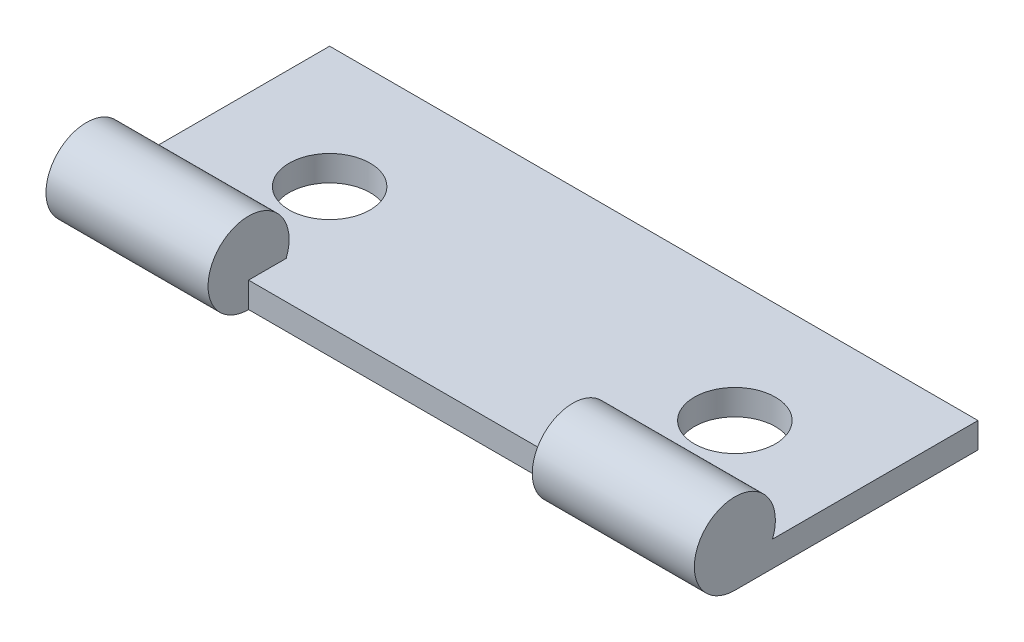
ISO-10303-21;
HEADER;
FILE_DESCRIPTION(('STEP AP214'),'2;1');
FILE_NAME('part.step','',(''),(''),'','','');
FILE_SCHEMA(('AUTOMOTIVE_DESIGN { 1 0 10303 214 1 1 1 1 }'));
ENDSEC;
DATA;
#1=APPLICATION_CONTEXT('core data for automotive mechanical design processes');
#2=APPLICATION_PROTOCOL_DEFINITION('international standard','automotive_design',2000,#1);
#3=PRODUCT_CONTEXT('',#1,'mechanical');
#4=PRODUCT('Part','Part','',(#3));
#5=PRODUCT_RELATED_PRODUCT_CATEGORY('part','',(#4));
#6=PRODUCT_DEFINITION_FORMATION('','',#4);
#7=PRODUCT_DEFINITION_CONTEXT('part definition',#1,'design');
#8=PRODUCT_DEFINITION('design','',#6,#7);
#9=PRODUCT_DEFINITION_SHAPE('','',#8);
#10=(LENGTH_UNIT() NAMED_UNIT(*) SI_UNIT(.MILLI.,.METRE.));
#11=(NAMED_UNIT(*) PLANE_ANGLE_UNIT() SI_UNIT($,.RADIAN.));
#12=(NAMED_UNIT(*) SI_UNIT($,.STERADIAN.) SOLID_ANGLE_UNIT());
#13=UNCERTAINTY_MEASURE_WITH_UNIT(LENGTH_MEASURE(1.E-05),#10,'distance_accuracy_value','');
#14=(GEOMETRIC_REPRESENTATION_CONTEXT(3) GLOBAL_UNCERTAINTY_ASSIGNED_CONTEXT((#13)) GLOBAL_UNIT_ASSIGNED_CONTEXT((#10,
#11,#12)) REPRESENTATION_CONTEXT('',''));
#15=CARTESIAN_POINT('',(0.,0.,0.));
#16=DIRECTION('',(0.,0.,1.));
#17=DIRECTION('',(1.,0.,0.));
#18=AXIS2_PLACEMENT_3D('',#15,#16,#17);
#19=CARTESIAN_POINT('',(0.,1.,0.));
#20=DIRECTION('',(0.,0.,-1.));
#21=DIRECTION('',(-1.,0.,0.));
#22=AXIS2_PLACEMENT_3D('',#19,#20,#21);
#23=PLANE('',#22);
#24=DIRECTION('',(1.,0.,0.));
#25=VECTOR('',#24,1.);
#26=CARTESIAN_POINT('',(0.,0.,0.));
#27=LINE('',#26,#25);
#28=CARTESIAN_POINT('',(6.35,0.,0.));
#29=VERTEX_POINT('',#28);
#30=CARTESIAN_POINT('',(19.05,0.,0.));
#31=VERTEX_POINT('',#30);
#32=EDGE_CURVE('E160',#29,#31,#27,.T.);
#33=ORIENTED_EDGE('',*,*,#32,.T.);
#34=DIRECTION('',(0.,1.,0.));
#35=VECTOR('',#34,1.);
#36=CARTESIAN_POINT('',(19.05,1.,0.));
#37=LINE('',#36,#35);
#38=CARTESIAN_POINT('',(19.05,1.,0.));
#39=VERTEX_POINT('',#38);
#40=EDGE_CURVE('E58',#31,#39,#37,.T.);
#41=ORIENTED_EDGE('',*,*,#40,.T.);
#42=DIRECTION('',(1.,0.,0.));
#43=VECTOR('',#42,1.);
#44=CARTESIAN_POINT('',(0.,1.,0.));
#45=LINE('',#44,#43);
#46=CARTESIAN_POINT('',(6.35,1.,0.));
#47=VERTEX_POINT('',#46);
#48=EDGE_CURVE('E153',#47,#39,#45,.T.);
#49=ORIENTED_EDGE('',*,*,#48,.F.);
#50=DIRECTION('',(0.,1.,0.));
#51=VECTOR('',#50,1.);
#52=CARTESIAN_POINT('',(6.35,1.,0.));
#53=LINE('',#52,#51);
#54=EDGE_CURVE('E11',#29,#47,#53,.T.);
#55=ORIENTED_EDGE('',*,*,#54,.F.);
#56=EDGE_LOOP('',(#33,#41,#49,#55));
#57=FACE_BOUND('',#56,.T.);
#58=ADVANCED_FACE('F35',(#57),#23,.F.);
#59=CARTESIAN_POINT('',(0.,1.,0.));
#60=DIRECTION('',(0.,-1.,0.));
#61=DIRECTION('',(0.,0.,-1.));
#62=AXIS2_PLACEMENT_3D('',#59,#60,#61);
#63=PLANE('',#62);
#64=DIRECTION('',(0.,0.,-1.));
#65=VECTOR('',#64,1.);
#66=CARTESIAN_POINT('',(19.05,1.,0.));
#67=LINE('',#66,#65);
#68=CARTESIAN_POINT('',(19.05,1.,-1.47478812037526));
#69=VERTEX_POINT('',#68);
#70=EDGE_CURVE('E50',#39,#69,#67,.T.);
#71=ORIENTED_EDGE('',*,*,#70,.T.);
#72=DIRECTION('',(-1.,0.,0.));
#73=VECTOR('',#72,1.);
#74=CARTESIAN_POINT('',(25.4,1.,-1.47478812037526));
#75=LINE('',#74,#73);
#76=CARTESIAN_POINT('',(25.4,1.,-1.47478812037526));
#77=VERTEX_POINT('',#76);
#78=EDGE_CURVE('E116',#69,#77,#75,.F.);
#79=ORIENTED_EDGE('',*,*,#78,.T.);
#80=DIRECTION('',(0.,0.,-1.));
#81=VECTOR('',#80,1.);
#82=CARTESIAN_POINT('',(25.4,1.,0.));
#83=LINE('',#82,#81);
#84=CARTESIAN_POINT('',(25.4,1.,-9.525));
#85=VERTEX_POINT('',#84);
#86=EDGE_CURVE('E120',#77,#85,#83,.T.);
#87=ORIENTED_EDGE('',*,*,#86,.T.);
#88=DIRECTION('',(-1.,0.,0.));
#89=VECTOR('',#88,1.);
#90=CARTESIAN_POINT('',(0.,1.,-9.525));
#91=LINE('',#90,#89);
#92=CARTESIAN_POINT('',(0.,1.,-9.525));
#93=VERTEX_POINT('',#92);
#94=EDGE_CURVE('E156',#85,#93,#91,.T.);
#95=ORIENTED_EDGE('',*,*,#94,.T.);
#96=DIRECTION('',(0.,0.,1.));
#97=VECTOR('',#96,1.);
#98=CARTESIAN_POINT('',(0.,1.,0.));
#99=LINE('',#98,#97);
#100=CARTESIAN_POINT('',(0.,1.,-1.47478812037526));
#101=VERTEX_POINT('',#100);
#102=EDGE_CURVE('E151',#93,#101,#99,.T.);
#103=ORIENTED_EDGE('',*,*,#102,.T.);
#104=DIRECTION('',(-1.,0.,0.));
#105=VECTOR('',#104,1.);
#106=CARTESIAN_POINT('',(6.35,1.,-1.47478812037526));
#107=LINE('',#106,#105);
#108=CARTESIAN_POINT('',(6.35,1.,-1.47478812037526));
#109=VERTEX_POINT('',#108);
#110=EDGE_CURVE('E136',#101,#109,#107,.F.);
#111=ORIENTED_EDGE('',*,*,#110,.T.);
#112=DIRECTION('',(0.,0.,-1.));
#113=VECTOR('',#112,1.);
#114=CARTESIAN_POINT('',(6.35,1.,0.));
#115=LINE('',#114,#113);
#116=EDGE_CURVE('E131',#47,#109,#115,.T.);
#117=ORIENTED_EDGE('',*,*,#116,.F.);
#118=ORIENTED_EDGE('',*,*,#48,.T.);
#119=EDGE_LOOP('',(#71,#79,#87,#95,#103,#111,#117,#118));
#120=FACE_BOUND('',#119,.T.);
#121=CARTESIAN_POINT('',(4.7625,1.,-4.7625));
#122=DIRECTION('',(0.,1.,0.));
#123=DIRECTION('',(0.,0.,1.));
#124=AXIS2_PLACEMENT_3D('',#121,#122,#123);
#125=CIRCLE('',#124,1.5875);
#126=CARTESIAN_POINT('',(4.7625,1.,-3.175));
#127=VERTEX_POINT('',#126);
#128=EDGE_CURVE('E145',#127,#127,#125,.T.);
#129=ORIENTED_EDGE('',*,*,#128,.F.);
#130=EDGE_LOOP('',(#129));
#131=FACE_BOUND('',#130,.T.);
#132=CARTESIAN_POINT('',(20.6375,1.,-4.7625));
#133=DIRECTION('',(0.,1.,0.));
#134=DIRECTION('',(0.,0.,-1.));
#135=AXIS2_PLACEMENT_3D('',#132,#133,#134);
#136=CIRCLE('',#135,1.5875);
#137=CARTESIAN_POINT('',(20.6375,1.,-6.35000000000001));
#138=VERTEX_POINT('',#137);
#139=EDGE_CURVE('E139',#138,#138,#136,.T.);
#140=ORIENTED_EDGE('',*,*,#139,.F.);
#141=EDGE_LOOP('',(#140));
#142=FACE_BOUND('',#141,.T.);
#143=ADVANCED_FACE('F170',(#120,#131,#142),#63,.F.);
#144=CARTESIAN_POINT('',(0.,0.,0.));
#145=DIRECTION('',(0.,-1.,0.));
#146=DIRECTION('',(0.,0.,-1.));
#147=AXIS2_PLACEMENT_3D('',#144,#145,#146);
#148=PLANE('',#147);
#149=CARTESIAN_POINT('',(4.7625,0.,-4.7625));
#150=DIRECTION('',(0.,1.,0.));
#151=DIRECTION('',(0.,0.,1.));
#152=AXIS2_PLACEMENT_3D('',#149,#150,#151);
#153=CIRCLE('',#152,1.5875);
#154=CARTESIAN_POINT('',(4.7625,0.,-3.175));
#155=VERTEX_POINT('',#154);
#156=EDGE_CURVE('E142',#155,#155,#153,.T.);
#157=ORIENTED_EDGE('',*,*,#156,.T.);
#158=EDGE_LOOP('',(#157));
#159=FACE_BOUND('',#158,.T.);
#160=DIRECTION('',(0.,0.,1.));
#161=VECTOR('',#160,1.);
#162=CARTESIAN_POINT('',(0.,0.,0.));
#163=LINE('',#162,#161);
#164=CARTESIAN_POINT('',(0.,0.,-9.525));
#165=VERTEX_POINT('',#164);
#166=CARTESIAN_POINT('',(0.,0.,0.));
#167=VERTEX_POINT('',#166);
#168=EDGE_CURVE('E148',#165,#167,#163,.T.);
#169=ORIENTED_EDGE('',*,*,#168,.F.);
#170=DIRECTION('',(-1.,0.,0.));
#171=VECTOR('',#170,1.);
#172=CARTESIAN_POINT('',(0.,0.,-9.525));
#173=LINE('',#172,#171);
#174=CARTESIAN_POINT('',(25.4,0.,-9.525));
#175=VERTEX_POINT('',#174);
#176=EDGE_CURVE('E102',#175,#165,#173,.T.);
#177=ORIENTED_EDGE('',*,*,#176,.F.);
#178=DIRECTION('',(0.,0.,-1.));
#179=VECTOR('',#178,1.);
#180=CARTESIAN_POINT('',(25.4,0.,0.));
#181=LINE('',#180,#179);
#182=CARTESIAN_POINT('',(25.4,0.,0.));
#183=VERTEX_POINT('',#182);
#184=EDGE_CURVE('E95',#183,#175,#181,.T.);
#185=ORIENTED_EDGE('',*,*,#184,.F.);
#186=DIRECTION('',(-1.,0.,0.));
#187=VECTOR('',#186,1.);
#188=CARTESIAN_POINT('',(25.4,0.,0.));
#189=LINE('',#188,#187);
#190=EDGE_CURVE('E101',#183,#31,#189,.T.);
#191=ORIENTED_EDGE('',*,*,#190,.T.);
#192=ORIENTED_EDGE('',*,*,#32,.F.);
#193=EDGE_CURVE('E107',#167,#29,#27,.T.);
#194=ORIENTED_EDGE('',*,*,#193,.F.);
#195=EDGE_LOOP('',(#169,#177,#185,#191,#192,#194));
#196=FACE_BOUND('',#195,.T.);
#197=CARTESIAN_POINT('',(20.6375,0.,-4.7625));
#198=DIRECTION('',(0.,1.,0.));
#199=DIRECTION('',(0.,0.,-1.));
#200=AXIS2_PLACEMENT_3D('',#197,#198,#199);
#201=CIRCLE('',#200,1.5875);
#202=CARTESIAN_POINT('',(20.6375,0.,-6.35000000000001));
#203=VERTEX_POINT('',#202);
#204=EDGE_CURVE('E138',#203,#203,#201,.T.);
#205=ORIENTED_EDGE('',*,*,#204,.T.);
#206=EDGE_LOOP('',(#205));
#207=FACE_BOUND('',#206,.T.);
#208=ADVANCED_FACE('F98',(#159,#196,#207),#148,.T.);
#209=CARTESIAN_POINT('',(0.,1.,0.));
#210=DIRECTION('',(1.,0.,0.));
#211=DIRECTION('',(0.,0.,-1.));
#212=AXIS2_PLACEMENT_3D('',#209,#210,#211);
#213=PLANE('',#212);
#214=CARTESIAN_POINT('',(0.,1.5875,0.));
#215=DIRECTION('',(-1.,0.,0.));
#216=DIRECTION('',(0.,0.,1.));
#217=AXIS2_PLACEMENT_3D('',#214,#215,#216);
#218=CIRCLE('',#217,1.5875);
#219=EDGE_CURVE('E127',#167,#101,#218,.T.);
#220=ORIENTED_EDGE('',*,*,#219,.T.);
#221=ORIENTED_EDGE('',*,*,#102,.F.);
#222=DIRECTION('',(0.,-1.,0.));
#223=VECTOR('',#222,1.);
#224=CARTESIAN_POINT('',(0.,1.,-9.525));
#225=LINE('',#224,#223);
#226=EDGE_CURVE('E158',#93,#165,#225,.T.);
#227=ORIENTED_EDGE('',*,*,#226,.T.);
#228=ORIENTED_EDGE('',*,*,#168,.T.);
#229=EDGE_LOOP('',(#220,#221,#227,#228));
#230=FACE_BOUND('',#229,.T.);
#231=ADVANCED_FACE('F37',(#230),#213,.F.);
#232=CARTESIAN_POINT('',(25.4,1.,0.));
#233=DIRECTION('',(-1.,0.,0.));
#234=DIRECTION('',(0.,0.,1.));
#235=AXIS2_PLACEMENT_3D('',#232,#233,#234);
#236=PLANE('',#235);
#237=CARTESIAN_POINT('',(25.4,1.5875,0.));
#238=DIRECTION('',(-1.,0.,0.));
#239=DIRECTION('',(0.,0.,1.));
#240=AXIS2_PLACEMENT_3D('',#237,#238,#239);
#241=CIRCLE('',#240,1.5875);
#242=EDGE_CURVE('E113',#183,#77,#241,.T.);
#243=ORIENTED_EDGE('',*,*,#242,.F.);
#244=ORIENTED_EDGE('',*,*,#184,.T.);
#245=DIRECTION('',(0.,-1.,0.));
#246=VECTOR('',#245,1.);
#247=CARTESIAN_POINT('',(25.4,1.,-9.525));
#248=LINE('',#247,#246);
#249=EDGE_CURVE('E43',#85,#175,#248,.T.);
#250=ORIENTED_EDGE('',*,*,#249,.F.);
#251=ORIENTED_EDGE('',*,*,#86,.F.);
#252=EDGE_LOOP('',(#243,#244,#250,#251));
#253=FACE_BOUND('',#252,.T.);
#254=ADVANCED_FACE('F119',(#253),#236,.F.);
#255=CARTESIAN_POINT('',(0.,1.,-9.525));
#256=DIRECTION('',(0.,0.,1.));
#257=DIRECTION('',(1.,0.,0.));
#258=AXIS2_PLACEMENT_3D('',#255,#256,#257);
#259=PLANE('',#258);
#260=ORIENTED_EDGE('',*,*,#176,.T.);
#261=ORIENTED_EDGE('',*,*,#226,.F.);
#262=ORIENTED_EDGE('',*,*,#94,.F.);
#263=ORIENTED_EDGE('',*,*,#249,.T.);
#264=EDGE_LOOP('',(#260,#261,#262,#263));
#265=FACE_BOUND('',#264,.T.);
#266=ADVANCED_FACE('F167',(#265),#259,.F.);
#267=CARTESIAN_POINT('',(4.7625,1.,-4.7625));
#268=DIRECTION('',(0.,-1.,0.));
#269=DIRECTION('',(0.,0.,-1.));
#270=AXIS2_PLACEMENT_3D('',#267,#268,#269);
#271=CYLINDRICAL_SURFACE('',#270,1.5875);
#272=ORIENTED_EDGE('',*,*,#128,.T.);
#273=EDGE_LOOP('',(#272));
#274=FACE_BOUND('',#273,.T.);
#275=ORIENTED_EDGE('',*,*,#156,.F.);
#276=EDGE_LOOP('',(#275));
#277=FACE_BOUND('',#276,.T.);
#278=ADVANCED_FACE('F196',(#274,#277),#271,.F.);
#279=CARTESIAN_POINT('',(20.6375,1.,-4.7625));
#280=DIRECTION('',(0.,-1.,0.));
#281=DIRECTION('',(0.,0.,-1.));
#282=AXIS2_PLACEMENT_3D('',#279,#280,#281);
#283=CYLINDRICAL_SURFACE('',#282,1.5875);
#284=ORIENTED_EDGE('',*,*,#139,.T.);
#285=EDGE_LOOP('',(#284));
#286=FACE_BOUND('',#285,.T.);
#287=ORIENTED_EDGE('',*,*,#204,.F.);
#288=EDGE_LOOP('',(#287));
#289=FACE_BOUND('',#288,.T.);
#290=ADVANCED_FACE('F202',(#286,#289),#283,.F.);
#291=CARTESIAN_POINT('',(6.35,1.5875,0.));
#292=DIRECTION('',(-1.,0.,0.));
#293=DIRECTION('',(0.,0.,1.));
#294=AXIS2_PLACEMENT_3D('',#291,#292,#293);
#295=CYLINDRICAL_SURFACE('',#294,1.5875);
#296=ORIENTED_EDGE('',*,*,#110,.F.);
#297=ORIENTED_EDGE('',*,*,#219,.F.);
#298=ORIENTED_EDGE('',*,*,#193,.T.);
#299=CARTESIAN_POINT('',(6.35,1.5875,0.));
#300=DIRECTION('',(-1.,0.,0.));
#301=DIRECTION('',(0.,0.,1.));
#302=AXIS2_PLACEMENT_3D('',#299,#300,#301);
#303=CIRCLE('',#302,1.5875);
#304=EDGE_CURVE('E128',#29,#109,#303,.T.);
#305=ORIENTED_EDGE('',*,*,#304,.T.);
#306=EDGE_LOOP('',(#296,#297,#298,#305));
#307=FACE_BOUND('',#306,.T.);
#308=ADVANCED_FACE('F183',(#307),#295,.T.);
#309=CARTESIAN_POINT('',(6.35,1.5875,0.));
#310=DIRECTION('',(-1.,0.,0.));
#311=DIRECTION('',(0.,0.,1.));
#312=AXIS2_PLACEMENT_3D('',#309,#310,#311);
#313=PLANE('',#312);
#314=ORIENTED_EDGE('',*,*,#54,.T.);
#315=ORIENTED_EDGE('',*,*,#116,.T.);
#316=ORIENTED_EDGE('',*,*,#304,.F.);
#317=EDGE_LOOP('',(#314,#315,#316));
#318=FACE_BOUND('',#317,.T.);
#319=ADVANCED_FACE('F176',(#318),#313,.F.);
#320=CARTESIAN_POINT('',(19.05,1.5875,0.));
#321=DIRECTION('',(-1.,0.,0.));
#322=DIRECTION('',(0.,0.,1.));
#323=AXIS2_PLACEMENT_3D('',#320,#321,#322);
#324=PLANE('',#323);
#325=ORIENTED_EDGE('',*,*,#40,.F.);
#326=CARTESIAN_POINT('',(19.05,1.5875,0.));
#327=DIRECTION('',(-1.,0.,0.));
#328=DIRECTION('',(0.,0.,1.));
#329=AXIS2_PLACEMENT_3D('',#326,#327,#328);
#330=CIRCLE('',#329,1.5875);
#331=EDGE_CURVE('E115',#31,#69,#330,.T.);
#332=ORIENTED_EDGE('',*,*,#331,.T.);
#333=ORIENTED_EDGE('',*,*,#70,.F.);
#334=EDGE_LOOP('',(#325,#332,#333));
#335=FACE_BOUND('',#334,.T.);
#336=ADVANCED_FACE('F174',(#335),#324,.T.);
#337=CARTESIAN_POINT('',(25.4,1.5875,0.));
#338=DIRECTION('',(-1.,0.,0.));
#339=DIRECTION('',(0.,0.,1.));
#340=AXIS2_PLACEMENT_3D('',#337,#338,#339);
#341=CYLINDRICAL_SURFACE('',#340,1.5875);
#342=ORIENTED_EDGE('',*,*,#78,.F.);
#343=ORIENTED_EDGE('',*,*,#331,.F.);
#344=ORIENTED_EDGE('',*,*,#190,.F.);
#345=ORIENTED_EDGE('',*,*,#242,.T.);
#346=EDGE_LOOP('',(#342,#343,#344,#345));
#347=FACE_BOUND('',#346,.T.);
#348=ADVANCED_FACE('F112',(#347),#341,.T.);
#349=CLOSED_SHELL('',(#58,#143,#208,#231,#254,#266,#278,#290,#308,#319,#336,#348));
#350=MANIFOLD_SOLID_BREP('B2',#349);
#351=ADVANCED_BREP_SHAPE_REPRESENTATION('',(#18,#350),#14);
#352=SHAPE_DEFINITION_REPRESENTATION(#9,#351);
ENDSEC;
END-ISO-10303-21;
